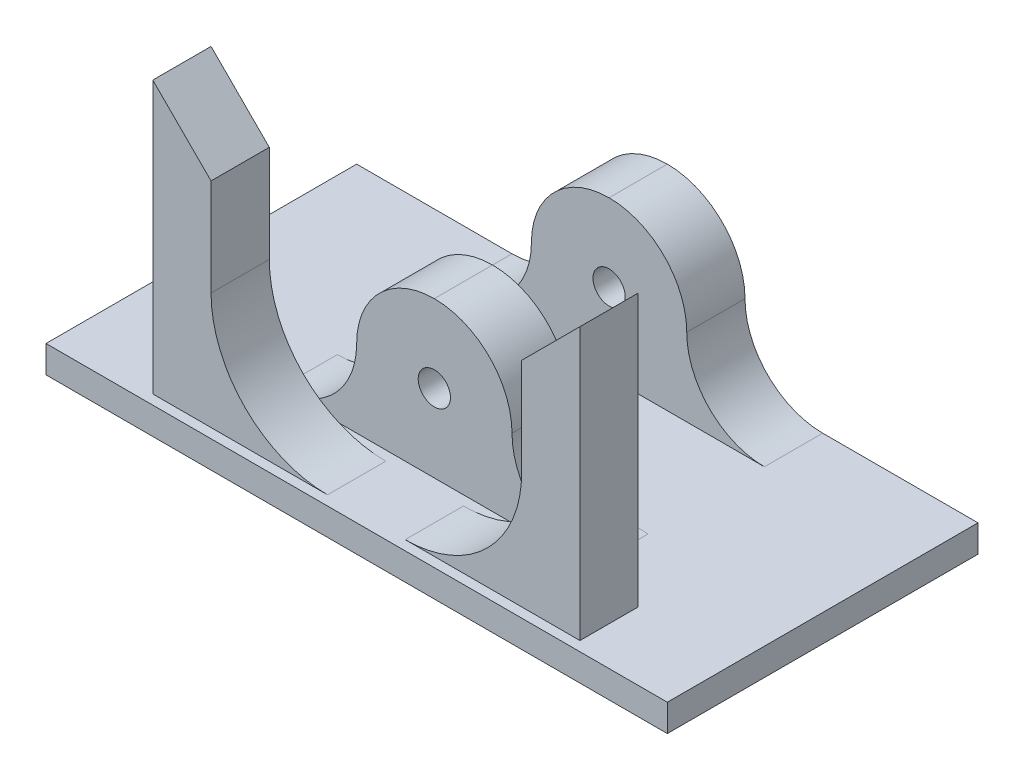
ISO-10303-21;
HEADER;
FILE_DESCRIPTION(('STEP AP214'),'2;1');
FILE_NAME('part.step','',(''),(''),'','','');
FILE_SCHEMA(('AUTOMOTIVE_DESIGN { 1 0 10303 214 1 1 1 1 }'));
ENDSEC;
DATA;
#1=APPLICATION_CONTEXT('core data for automotive mechanical design processes');
#2=APPLICATION_PROTOCOL_DEFINITION('international standard','automotive_design',2000,#1);
#3=PRODUCT_CONTEXT('',#1,'mechanical');
#4=PRODUCT('Part','Part','',(#3));
#5=PRODUCT_RELATED_PRODUCT_CATEGORY('part','',(#4));
#6=PRODUCT_DEFINITION_FORMATION('','',#4);
#7=PRODUCT_DEFINITION_CONTEXT('part definition',#1,'design');
#8=PRODUCT_DEFINITION('design','',#6,#7);
#9=PRODUCT_DEFINITION_SHAPE('','',#8);
#10=(LENGTH_UNIT() NAMED_UNIT(*) SI_UNIT(.MILLI.,.METRE.));
#11=(NAMED_UNIT(*) PLANE_ANGLE_UNIT() SI_UNIT($,.RADIAN.));
#12=(NAMED_UNIT(*) SI_UNIT($,.STERADIAN.) SOLID_ANGLE_UNIT());
#13=UNCERTAINTY_MEASURE_WITH_UNIT(LENGTH_MEASURE(1.E-05),#10,'distance_accuracy_value','');
#14=(GEOMETRIC_REPRESENTATION_CONTEXT(3) GLOBAL_UNCERTAINTY_ASSIGNED_CONTEXT((#13)) GLOBAL_UNIT_ASSIGNED_CONTEXT((#10,
#11,#12)) REPRESENTATION_CONTEXT('',''));
#15=CARTESIAN_POINT('',(0.,0.,0.));
#16=DIRECTION('',(0.,0.,1.));
#17=DIRECTION('',(1.,0.,0.));
#18=AXIS2_PLACEMENT_3D('',#15,#16,#17);
#19=CARTESIAN_POINT('',(0.,7.,0.));
#20=DIRECTION('',(0.,1.,0.));
#21=DIRECTION('',(0.,0.,1.));
#22=AXIS2_PLACEMENT_3D('',#19,#20,#21);
#23=PLANE('',#22);
#24=DIRECTION('',(-1.,0.,0.));
#25=VECTOR('',#24,1.);
#26=CARTESIAN_POINT('',(-160.,7.,20.));
#27=LINE('',#26,#25);
#28=CARTESIAN_POINT('',(0.,7.,20.));
#29=VERTEX_POINT('',#28);
#30=CARTESIAN_POINT('',(-160.,7.,20.));
#31=VERTEX_POINT('',#30);
#32=EDGE_CURVE('E260',#29,#31,#27,.T.);
#33=ORIENTED_EDGE('',*,*,#32,.F.);
#34=DIRECTION('',(0.,0.,-1.));
#35=VECTOR('',#34,1.);
#36=CARTESIAN_POINT('',(0.,7.,0.));
#37=LINE('',#36,#35);
#38=CARTESIAN_POINT('',(0.,7.,-60.));
#39=VERTEX_POINT('',#38);
#40=EDGE_CURVE('E287',#29,#39,#37,.T.);
#41=ORIENTED_EDGE('',*,*,#40,.T.);
#42=DIRECTION('',(-1.,0.,0.));
#43=VECTOR('',#42,1.);
#44=CARTESIAN_POINT('',(0.,7.,-60.));
#45=LINE('',#44,#43);
#46=CARTESIAN_POINT('',(-40.,7.,-60.));
#47=VERTEX_POINT('',#46);
#48=EDGE_CURVE('E292',#39,#47,#45,.T.);
#49=ORIENTED_EDGE('',*,*,#48,.T.);
#50=DIRECTION('',(0.,0.,-1.));
#51=VECTOR('',#50,1.);
#52=CARTESIAN_POINT('',(-40.,7.,0.));
#53=LINE('',#52,#51);
#54=CARTESIAN_POINT('',(-40.,7.,-45.));
#55=VERTEX_POINT('',#54);
#56=EDGE_CURVE('E336',#47,#55,#53,.F.);
#57=ORIENTED_EDGE('',*,*,#56,.T.);
#58=DIRECTION('',(1.,0.,0.));
#59=VECTOR('',#58,1.);
#60=CARTESIAN_POINT('',(-100.,7.,-45.));
#61=LINE('',#60,#59);
#62=CARTESIAN_POINT('',(-120.,7.,-45.));
#63=VERTEX_POINT('',#62);
#64=EDGE_CURVE('E278',#63,#55,#61,.T.);
#65=ORIENTED_EDGE('',*,*,#64,.F.);
#66=DIRECTION('',(0.,0.,1.));
#67=VECTOR('',#66,1.);
#68=CARTESIAN_POINT('',(-120.,7.,0.));
#69=LINE('',#68,#67);
#70=CARTESIAN_POINT('',(-120.,7.,-60.));
#71=VERTEX_POINT('',#70);
#72=EDGE_CURVE('E344',#63,#71,#69,.F.);
#73=ORIENTED_EDGE('',*,*,#72,.T.);
#74=CARTESIAN_POINT('',(-160.,7.,-60.));
#75=VERTEX_POINT('',#74);
#76=EDGE_CURVE('E290',#71,#75,#45,.T.);
#77=ORIENTED_EDGE('',*,*,#76,.T.);
#78=DIRECTION('',(0.,0.,1.));
#79=VECTOR('',#78,1.);
#80=CARTESIAN_POINT('',(-160.,7.,0.));
#81=LINE('',#80,#79);
#82=EDGE_CURVE('E295',#75,#31,#81,.T.);
#83=ORIENTED_EDGE('',*,*,#82,.T.);
#84=EDGE_LOOP('',(#33,#41,#49,#57,#65,#73,#77,#83));
#85=FACE_BOUND('',#84,.T.);
#86=DIRECTION('',(0.,0.,-1.));
#87=VECTOR('',#86,1.);
#88=CARTESIAN_POINT('',(-40.,7.,0.));
#89=LINE('',#88,#87);
#90=CARTESIAN_POINT('',(-40.,7.,-15.));
#91=VERTEX_POINT('',#90);
#92=CARTESIAN_POINT('',(-40.,7.,0.));
#93=VERTEX_POINT('',#92);
#94=EDGE_CURVE('E341',#91,#93,#89,.F.);
#95=ORIENTED_EDGE('',*,*,#94,.T.);
#96=DIRECTION('',(-1.,0.,0.));
#97=VECTOR('',#96,1.);
#98=CARTESIAN_POINT('',(-160.,7.,0.));
#99=LINE('',#98,#97);
#100=CARTESIAN_POINT('',(-120.,7.,0.));
#101=VERTEX_POINT('',#100);
#102=EDGE_CURVE('E264',#93,#101,#99,.T.);
#103=ORIENTED_EDGE('',*,*,#102,.T.);
#104=DIRECTION('',(0.,0.,1.));
#105=VECTOR('',#104,1.);
#106=CARTESIAN_POINT('',(-120.,7.,0.));
#107=LINE('',#106,#105);
#108=CARTESIAN_POINT('',(-120.,7.,-15.));
#109=VERTEX_POINT('',#108);
#110=EDGE_CURVE('E346',#101,#109,#107,.F.);
#111=ORIENTED_EDGE('',*,*,#110,.T.);
#112=DIRECTION('',(1.,0.,0.));
#113=VECTOR('',#112,1.);
#114=CARTESIAN_POINT('',(-100.,7.,-15.));
#115=LINE('',#114,#113);
#116=EDGE_CURVE('E277',#109,#91,#115,.T.);
#117=ORIENTED_EDGE('',*,*,#116,.T.);
#118=EDGE_LOOP('',(#95,#103,#111,#117));
#119=FACE_BOUND('',#118,.T.);
#120=DIRECTION('',(-1.,0.,0.));
#121=VECTOR('',#120,1.);
#122=CARTESIAN_POINT('',(-135.,7.,2.5));
#123=LINE('',#122,#121);
#124=CARTESIAN_POINT('',(-90.,7.,2.5));
#125=VERTEX_POINT('',#124);
#126=CARTESIAN_POINT('',(-135.,7.,2.5));
#127=VERTEX_POINT('',#126);
#128=EDGE_CURVE('E237',#125,#127,#123,.T.);
#129=ORIENTED_EDGE('',*,*,#128,.F.);
#130=DIRECTION('',(0.,0.,-1.));
#131=VECTOR('',#130,1.);
#132=CARTESIAN_POINT('',(-90.,7.,0.));
#133=LINE('',#132,#131);
#134=CARTESIAN_POINT('',(-90.,7.,17.5));
#135=VERTEX_POINT('',#134);
#136=EDGE_CURVE('E369',#125,#135,#133,.F.);
#137=ORIENTED_EDGE('',*,*,#136,.T.);
#138=DIRECTION('',(1.,0.,0.));
#139=VECTOR('',#138,1.);
#140=CARTESIAN_POINT('',(-135.,7.,17.5));
#141=LINE('',#140,#139);
#142=CARTESIAN_POINT('',(-135.,7.,17.5));
#143=VERTEX_POINT('',#142);
#144=EDGE_CURVE('E240',#143,#135,#141,.T.);
#145=ORIENTED_EDGE('',*,*,#144,.F.);
#146=DIRECTION('',(0.,0.,1.));
#147=VECTOR('',#146,1.);
#148=CARTESIAN_POINT('',(-135.,7.,2.5));
#149=LINE('',#148,#147);
#150=EDGE_CURVE('E216',#127,#143,#149,.T.);
#151=ORIENTED_EDGE('',*,*,#150,.F.);
#152=EDGE_LOOP('',(#129,#137,#145,#151));
#153=FACE_BOUND('',#152,.T.);
#154=DIRECTION('',(1.,0.,0.));
#155=VECTOR('',#154,1.);
#156=CARTESIAN_POINT('',(-25.,7.,17.5));
#157=LINE('',#156,#155);
#158=CARTESIAN_POINT('',(-70.,7.,17.5));
#159=VERTEX_POINT('',#158);
#160=CARTESIAN_POINT('',(-25.,7.,17.5));
#161=VERTEX_POINT('',#160);
#162=EDGE_CURVE('E222',#159,#161,#157,.T.);
#163=ORIENTED_EDGE('',*,*,#162,.F.);
#164=DIRECTION('',(0.,0.,1.));
#165=VECTOR('',#164,1.);
#166=CARTESIAN_POINT('',(-70.,7.,0.));
#167=LINE('',#166,#165);
#168=CARTESIAN_POINT('',(-70.,7.,2.5));
#169=VERTEX_POINT('',#168);
#170=EDGE_CURVE('E372',#159,#169,#167,.F.);
#171=ORIENTED_EDGE('',*,*,#170,.T.);
#172=DIRECTION('',(-1.,0.,0.));
#173=VECTOR('',#172,1.);
#174=CARTESIAN_POINT('',(-25.,7.,2.5));
#175=LINE('',#174,#173);
#176=CARTESIAN_POINT('',(-25.,7.,2.5));
#177=VERTEX_POINT('',#176);
#178=EDGE_CURVE('E226',#177,#169,#175,.T.);
#179=ORIENTED_EDGE('',*,*,#178,.F.);
#180=DIRECTION('',(0.,0.,-1.));
#181=VECTOR('',#180,1.);
#182=CARTESIAN_POINT('',(-25.,7.,2.5));
#183=LINE('',#182,#181);
#184=EDGE_CURVE('E214',#161,#177,#183,.T.);
#185=ORIENTED_EDGE('',*,*,#184,.F.);
#186=EDGE_LOOP('',(#163,#171,#179,#185));
#187=FACE_BOUND('',#186,.T.);
#188=ADVANCED_FACE('F36',(#85,#119,#153,#187),#23,.T.);
#189=CARTESIAN_POINT('',(0.,7.,0.));
#190=DIRECTION('',(0.,0.,-1.));
#191=DIRECTION('',(-1.,0.,0.));
#192=AXIS2_PLACEMENT_3D('',#189,#190,#191);
#193=PLANE('',#192);
#194=CARTESIAN_POINT('',(-80.,27.,0.));
#195=DIRECTION('',(0.,0.,1.));
#196=DIRECTION('',(1.,0.,0.));
#197=AXIS2_PLACEMENT_3D('',#194,#195,#196);
#198=CIRCLE('',#197,4.15);
#199=CARTESIAN_POINT('',(-75.85,27.,0.));
#200=VERTEX_POINT('',#199);
#201=EDGE_CURVE('E263',#200,#200,#198,.T.);
#202=ORIENTED_EDGE('',*,*,#201,.F.);
#203=EDGE_LOOP('',(#202));
#204=FACE_BOUND('',#203,.T.);
#205=ORIENTED_EDGE('',*,*,#102,.F.);
#206=CARTESIAN_POINT('',(-40.,27.,0.));
#207=DIRECTION('',(0.,0.,-1.));
#208=DIRECTION('',(-1.,0.,0.));
#209=AXIS2_PLACEMENT_3D('',#206,#207,#208);
#210=CIRCLE('',#209,20.);
#211=CARTESIAN_POINT('',(-60.,27.,0.));
#212=VERTEX_POINT('',#211);
#213=EDGE_CURVE('E362',#93,#212,#210,.T.);
#214=ORIENTED_EDGE('',*,*,#213,.T.);
#215=CARTESIAN_POINT('',(-80.,27.,0.));
#216=DIRECTION('',(0.,0.,-1.));
#217=DIRECTION('',(-1.,0.,0.));
#218=AXIS2_PLACEMENT_3D('',#215,#216,#217);
#219=CIRCLE('',#218,20.);
#220=CARTESIAN_POINT('',(-80.,47.,0.));
#221=VERTEX_POINT('',#220);
#222=EDGE_CURVE('E322',#212,#221,#219,.F.);
#223=ORIENTED_EDGE('',*,*,#222,.T.);
#224=CARTESIAN_POINT('',(-80.,27.,0.));
#225=DIRECTION('',(0.,0.,-1.));
#226=DIRECTION('',(-1.,0.,0.));
#227=AXIS2_PLACEMENT_3D('',#224,#225,#226);
#228=CIRCLE('',#227,20.);
#229=CARTESIAN_POINT('',(-100.,27.,0.));
#230=VERTEX_POINT('',#229);
#231=EDGE_CURVE('E319',#221,#230,#228,.F.);
#232=ORIENTED_EDGE('',*,*,#231,.T.);
#233=CARTESIAN_POINT('',(-120.,27.,0.));
#234=DIRECTION('',(0.,0.,-1.));
#235=DIRECTION('',(-1.,0.,0.));
#236=AXIS2_PLACEMENT_3D('',#233,#234,#235);
#237=CIRCLE('',#236,20.);
#238=EDGE_CURVE('E349',#230,#101,#237,.T.);
#239=ORIENTED_EDGE('',*,*,#238,.T.);
#240=EDGE_LOOP('',(#205,#214,#223,#232,#239));
#241=FACE_BOUND('',#240,.T.);
#242=ADVANCED_FACE('F404',(#204,#241),#193,.F.);
#243=CARTESIAN_POINT('',(-80.,27.,0.));
#244=DIRECTION('',(0.,0.,-1.));
#245=DIRECTION('',(-1.,0.,0.));
#246=AXIS2_PLACEMENT_3D('',#243,#244,#245);
#247=CYLINDRICAL_SURFACE('',#246,20.);
#248=CARTESIAN_POINT('',(-80.,27.,-15.));
#249=DIRECTION('',(0.,0.,1.));
#250=DIRECTION('',(1.,0.,0.));
#251=AXIS2_PLACEMENT_3D('',#248,#249,#250);
#252=CIRCLE('',#251,20.);
#253=CARTESIAN_POINT('',(-100.,27.,-15.));
#254=VERTEX_POINT('',#253);
#255=CARTESIAN_POINT('',(-80.,47.,-15.));
#256=VERTEX_POINT('',#255);
#257=EDGE_CURVE('E284',#254,#256,#252,.F.);
#258=ORIENTED_EDGE('',*,*,#257,.F.);
#259=DIRECTION('',(0.,0.,1.));
#260=VECTOR('',#259,1.);
#261=CARTESIAN_POINT('',(-100.,27.,-60.));
#262=LINE('',#261,#260);
#263=EDGE_CURVE('E326',#230,#254,#262,.F.);
#264=ORIENTED_EDGE('',*,*,#263,.F.);
#265=ORIENTED_EDGE('',*,*,#231,.F.);
#266=DIRECTION('',(0.,0.,1.));
#267=VECTOR('',#266,1.);
#268=CARTESIAN_POINT('',(-80.,47.,0.));
#269=LINE('',#268,#267);
#270=EDGE_CURVE('E286',#256,#221,#269,.T.);
#271=ORIENTED_EDGE('',*,*,#270,.F.);
#272=EDGE_LOOP('',(#258,#264,#265,#271));
#273=FACE_BOUND('',#272,.T.);
#274=ADVANCED_FACE('F410',(#273),#247,.T.);
#275=CARTESIAN_POINT('',(-80.,27.,0.));
#276=DIRECTION('',(0.,0.,1.));
#277=DIRECTION('',(1.,0.,0.));
#278=AXIS2_PLACEMENT_3D('',#275,#276,#277);
#279=CYLINDRICAL_SURFACE('',#278,20.);
#280=CARTESIAN_POINT('',(-80.,27.,-15.));
#281=DIRECTION('',(0.,0.,1.));
#282=DIRECTION('',(1.,0.,0.));
#283=AXIS2_PLACEMENT_3D('',#280,#281,#282);
#284=CIRCLE('',#283,20.);
#285=CARTESIAN_POINT('',(-60.,27.,-15.));
#286=VERTEX_POINT('',#285);
#287=EDGE_CURVE('E333',#256,#286,#284,.F.);
#288=ORIENTED_EDGE('',*,*,#287,.F.);
#289=ORIENTED_EDGE('',*,*,#270,.T.);
#290=ORIENTED_EDGE('',*,*,#222,.F.);
#291=DIRECTION('',(0.,0.,-1.));
#292=VECTOR('',#291,1.);
#293=CARTESIAN_POINT('',(-60.,27.,0.));
#294=LINE('',#293,#292);
#295=EDGE_CURVE('E315',#286,#212,#294,.F.);
#296=ORIENTED_EDGE('',*,*,#295,.F.);
#297=EDGE_LOOP('',(#288,#289,#290,#296));
#298=FACE_BOUND('',#297,.T.);
#299=ADVANCED_FACE('F435',(#298),#279,.T.);
#300=CARTESIAN_POINT('',(0.,7.,0.));
#301=DIRECTION('',(-1.,0.,0.));
#302=DIRECTION('',(0.,0.,1.));
#303=AXIS2_PLACEMENT_3D('',#300,#301,#302);
#304=PLANE('',#303);
#305=DIRECTION('',(0.,0.,-1.));
#306=VECTOR('',#305,1.);
#307=CARTESIAN_POINT('',(0.,0.,0.));
#308=LINE('',#307,#306);
#309=CARTESIAN_POINT('',(0.,0.,20.));
#310=VERTEX_POINT('',#309);
#311=CARTESIAN_POINT('',(0.,0.,-60.));
#312=VERTEX_POINT('',#311);
#313=EDGE_CURVE('E298',#310,#312,#308,.T.);
#314=ORIENTED_EDGE('',*,*,#313,.T.);
#315=DIRECTION('',(0.,-1.,0.));
#316=VECTOR('',#315,1.);
#317=CARTESIAN_POINT('',(0.,7.,-60.));
#318=LINE('',#317,#316);
#319=EDGE_CURVE('E307',#39,#312,#318,.T.);
#320=ORIENTED_EDGE('',*,*,#319,.F.);
#321=ORIENTED_EDGE('',*,*,#40,.F.);
#322=DIRECTION('',(0.,1.,0.));
#323=VECTOR('',#322,1.);
#324=CARTESIAN_POINT('',(0.,7.,20.));
#325=LINE('',#324,#323);
#326=EDGE_CURVE('E257',#310,#29,#325,.T.);
#327=ORIENTED_EDGE('',*,*,#326,.F.);
#328=EDGE_LOOP('',(#314,#320,#321,#327));
#329=FACE_BOUND('',#328,.T.);
#330=ADVANCED_FACE('F431',(#329),#304,.F.);
#331=CARTESIAN_POINT('',(0.,7.,-60.));
#332=DIRECTION('',(0.,0.,1.));
#333=DIRECTION('',(1.,0.,0.));
#334=AXIS2_PLACEMENT_3D('',#331,#332,#333);
#335=PLANE('',#334);
#336=CARTESIAN_POINT('',(-80.,27.,-60.));
#337=DIRECTION('',(0.,0.,1.));
#338=DIRECTION('',(1.,0.,0.));
#339=AXIS2_PLACEMENT_3D('',#336,#337,#338);
#340=CIRCLE('',#339,4.15);
#341=CARTESIAN_POINT('',(-75.85,27.,-60.));
#342=VERTEX_POINT('',#341);
#343=EDGE_CURVE('E268',#342,#342,#340,.T.);
#344=ORIENTED_EDGE('',*,*,#343,.T.);
#345=EDGE_LOOP('',(#344));
#346=FACE_BOUND('',#345,.T.);
#347=CARTESIAN_POINT('',(-80.,27.,-60.));
#348=DIRECTION('',(0.,0.,1.));
#349=DIRECTION('',(1.,0.,0.));
#350=AXIS2_PLACEMENT_3D('',#347,#348,#349);
#351=CIRCLE('',#350,20.);
#352=CARTESIAN_POINT('',(-100.,27.,-60.));
#353=VERTEX_POINT('',#352);
#354=CARTESIAN_POINT('',(-80.,47.,-60.));
#355=VERTEX_POINT('',#354);
#356=EDGE_CURVE('E310',#353,#355,#351,.F.);
#357=ORIENTED_EDGE('',*,*,#356,.T.);
#358=CARTESIAN_POINT('',(-80.,27.,-60.));
#359=DIRECTION('',(0.,0.,1.));
#360=DIRECTION('',(1.,0.,0.));
#361=AXIS2_PLACEMENT_3D('',#358,#359,#360);
#362=CIRCLE('',#361,20.);
#363=CARTESIAN_POINT('',(-60.,27.,-60.));
#364=VERTEX_POINT('',#363);
#365=EDGE_CURVE('E312',#355,#364,#362,.F.);
#366=ORIENTED_EDGE('',*,*,#365,.T.);
#367=CARTESIAN_POINT('',(-40.,27.,-60.));
#368=DIRECTION('',(0.,0.,1.));
#369=DIRECTION('',(1.,0.,0.));
#370=AXIS2_PLACEMENT_3D('',#367,#368,#369);
#371=CIRCLE('',#370,20.);
#372=EDGE_CURVE('E364',#364,#47,#371,.T.);
#373=ORIENTED_EDGE('',*,*,#372,.T.);
#374=ORIENTED_EDGE('',*,*,#48,.F.);
#375=ORIENTED_EDGE('',*,*,#319,.T.);
#376=DIRECTION('',(-1.,0.,0.));
#377=VECTOR('',#376,1.);
#378=CARTESIAN_POINT('',(0.,0.,-60.));
#379=LINE('',#378,#377);
#380=CARTESIAN_POINT('',(-160.,0.,-60.));
#381=VERTEX_POINT('',#380);
#382=EDGE_CURVE('E301',#312,#381,#379,.T.);
#383=ORIENTED_EDGE('',*,*,#382,.T.);
#384=DIRECTION('',(0.,-1.,0.));
#385=VECTOR('',#384,1.);
#386=CARTESIAN_POINT('',(-160.,7.,-60.));
#387=LINE('',#386,#385);
#388=EDGE_CURVE('E297',#75,#381,#387,.T.);
#389=ORIENTED_EDGE('',*,*,#388,.F.);
#390=ORIENTED_EDGE('',*,*,#76,.F.);
#391=CARTESIAN_POINT('',(-120.,27.,-60.));
#392=DIRECTION('',(0.,0.,1.));
#393=DIRECTION('',(1.,0.,0.));
#394=AXIS2_PLACEMENT_3D('',#391,#392,#393);
#395=CIRCLE('',#394,20.);
#396=EDGE_CURVE('E357',#71,#353,#395,.T.);
#397=ORIENTED_EDGE('',*,*,#396,.T.);
#398=EDGE_LOOP('',(#357,#366,#373,#374,#375,#383,#389,#390,#397));
#399=FACE_BOUND('',#398,.T.);
#400=ADVANCED_FACE('F427',(#346,#399),#335,.F.);
#401=CARTESIAN_POINT('',(-160.,7.,0.));
#402=DIRECTION('',(1.,0.,0.));
#403=DIRECTION('',(0.,0.,-1.));
#404=AXIS2_PLACEMENT_3D('',#401,#402,#403);
#405=PLANE('',#404);
#406=DIRECTION('',(0.,0.,1.));
#407=VECTOR('',#406,1.);
#408=CARTESIAN_POINT('',(-160.,0.,0.));
#409=LINE('',#408,#407);
#410=CARTESIAN_POINT('',(-160.,0.,20.));
#411=VERTEX_POINT('',#410);
#412=EDGE_CURVE('E291',#381,#411,#409,.T.);
#413=ORIENTED_EDGE('',*,*,#412,.T.);
#414=DIRECTION('',(0.,-1.,0.));
#415=VECTOR('',#414,1.);
#416=CARTESIAN_POINT('',(-160.,7.,20.));
#417=LINE('',#416,#415);
#418=EDGE_CURVE('E251',#31,#411,#417,.T.);
#419=ORIENTED_EDGE('',*,*,#418,.F.);
#420=ORIENTED_EDGE('',*,*,#82,.F.);
#421=ORIENTED_EDGE('',*,*,#388,.T.);
#422=EDGE_LOOP('',(#413,#419,#420,#421));
#423=FACE_BOUND('',#422,.T.);
#424=ADVANCED_FACE('F422',(#423),#405,.F.);
#425=CARTESIAN_POINT('',(0.,0.,0.));
#426=DIRECTION('',(0.,1.,0.));
#427=DIRECTION('',(0.,0.,1.));
#428=AXIS2_PLACEMENT_3D('',#425,#426,#427);
#429=PLANE('',#428);
#430=ORIENTED_EDGE('',*,*,#313,.F.);
#431=DIRECTION('',(1.,0.,0.));
#432=VECTOR('',#431,1.);
#433=CARTESIAN_POINT('',(-160.,0.,20.));
#434=LINE('',#433,#432);
#435=EDGE_CURVE('E254',#411,#310,#434,.T.);
#436=ORIENTED_EDGE('',*,*,#435,.F.);
#437=ORIENTED_EDGE('',*,*,#412,.F.);
#438=ORIENTED_EDGE('',*,*,#382,.F.);
#439=EDGE_LOOP('',(#430,#436,#437,#438));
#440=FACE_BOUND('',#439,.T.);
#441=ADVANCED_FACE('F419',(#440),#429,.F.);
#442=CARTESIAN_POINT('',(-80.,27.,-45.));
#443=DIRECTION('',(0.,0.,-1.));
#444=DIRECTION('',(-1.,0.,0.));
#445=AXIS2_PLACEMENT_3D('',#442,#443,#444);
#446=CIRCLE('',#445,20.);
#447=CARTESIAN_POINT('',(-80.,47.,-45.));
#448=VERTEX_POINT('',#447);
#449=CARTESIAN_POINT('',(-100.,27.,-45.));
#450=VERTEX_POINT('',#449);
#451=EDGE_CURVE('E280',#448,#450,#446,.F.);
#452=ORIENTED_EDGE('',*,*,#451,.F.);
#453=EDGE_CURVE('E302',#355,#448,#269,.T.);
#454=ORIENTED_EDGE('',*,*,#453,.F.);
#455=ORIENTED_EDGE('',*,*,#356,.F.);
#456=EDGE_CURVE('E325',#450,#353,#262,.F.);
#457=ORIENTED_EDGE('',*,*,#456,.F.);
#458=EDGE_LOOP('',(#452,#454,#455,#457));
#459=FACE_BOUND('',#458,.T.);
#460=ADVANCED_FACE('F421',(#459),#247,.T.);
#461=CARTESIAN_POINT('',(-80.,27.,-45.));
#462=DIRECTION('',(0.,0.,-1.));
#463=DIRECTION('',(-1.,0.,0.));
#464=AXIS2_PLACEMENT_3D('',#461,#462,#463);
#465=CIRCLE('',#464,20.);
#466=CARTESIAN_POINT('',(-60.,27.,-45.));
#467=VERTEX_POINT('',#466);
#468=EDGE_CURVE('E329',#467,#448,#465,.F.);
#469=ORIENTED_EDGE('',*,*,#468,.F.);
#470=EDGE_CURVE('E316',#364,#467,#294,.F.);
#471=ORIENTED_EDGE('',*,*,#470,.F.);
#472=ORIENTED_EDGE('',*,*,#365,.F.);
#473=ORIENTED_EDGE('',*,*,#453,.T.);
#474=EDGE_LOOP('',(#469,#471,#472,#473));
#475=FACE_BOUND('',#474,.T.);
#476=ADVANCED_FACE('F437',(#475),#279,.T.);
#477=CARTESIAN_POINT('',(-100.,7.,-15.));
#478=DIRECTION('',(0.,0.,1.));
#479=DIRECTION('',(1.,0.,0.));
#480=AXIS2_PLACEMENT_3D('',#477,#478,#479);
#481=PLANE('',#480);
#482=CARTESIAN_POINT('',(-80.,27.,-15.));
#483=DIRECTION('',(0.,0.,1.));
#484=DIRECTION('',(1.,0.,0.));
#485=AXIS2_PLACEMENT_3D('',#482,#483,#484);
#486=CIRCLE('',#485,4.15);
#487=CARTESIAN_POINT('',(-75.85,27.,-15.));
#488=VERTEX_POINT('',#487);
#489=EDGE_CURVE('E274',#488,#488,#486,.T.);
#490=ORIENTED_EDGE('',*,*,#489,.T.);
#491=EDGE_LOOP('',(#490));
#492=FACE_BOUND('',#491,.T.);
#493=ORIENTED_EDGE('',*,*,#257,.T.);
#494=ORIENTED_EDGE('',*,*,#287,.T.);
#495=CARTESIAN_POINT('',(-40.,27.,-15.));
#496=DIRECTION('',(0.,0.,1.));
#497=DIRECTION('',(1.,0.,0.));
#498=AXIS2_PLACEMENT_3D('',#495,#496,#497);
#499=CIRCLE('',#498,20.);
#500=EDGE_CURVE('E359',#286,#91,#499,.T.);
#501=ORIENTED_EDGE('',*,*,#500,.T.);
#502=ORIENTED_EDGE('',*,*,#116,.F.);
#503=CARTESIAN_POINT('',(-120.,27.,-15.));
#504=DIRECTION('',(0.,0.,1.));
#505=DIRECTION('',(1.,0.,0.));
#506=AXIS2_PLACEMENT_3D('',#503,#504,#505);
#507=CIRCLE('',#506,20.);
#508=EDGE_CURVE('E352',#109,#254,#507,.T.);
#509=ORIENTED_EDGE('',*,*,#508,.T.);
#510=EDGE_LOOP('',(#493,#494,#501,#502,#509));
#511=FACE_BOUND('',#510,.T.);
#512=ADVANCED_FACE('F417',(#492,#511),#481,.F.);
#513=CARTESIAN_POINT('',(-100.,7.,-45.));
#514=DIRECTION('',(0.,0.,-1.));
#515=DIRECTION('',(-1.,0.,0.));
#516=AXIS2_PLACEMENT_3D('',#513,#514,#515);
#517=PLANE('',#516);
#518=CARTESIAN_POINT('',(-80.,27.,-45.));
#519=DIRECTION('',(0.,0.,-1.));
#520=DIRECTION('',(-1.,0.,0.));
#521=AXIS2_PLACEMENT_3D('',#518,#519,#520);
#522=CIRCLE('',#521,4.15);
#523=CARTESIAN_POINT('',(-84.15,27.,-45.));
#524=VERTEX_POINT('',#523);
#525=EDGE_CURVE('E271',#524,#524,#522,.T.);
#526=ORIENTED_EDGE('',*,*,#525,.T.);
#527=EDGE_LOOP('',(#526));
#528=FACE_BOUND('',#527,.T.);
#529=ORIENTED_EDGE('',*,*,#451,.T.);
#530=CARTESIAN_POINT('',(-120.,27.,-45.));
#531=DIRECTION('',(0.,0.,-1.));
#532=DIRECTION('',(-1.,0.,0.));
#533=AXIS2_PLACEMENT_3D('',#530,#531,#532);
#534=CIRCLE('',#533,20.);
#535=EDGE_CURVE('E354',#450,#63,#534,.T.);
#536=ORIENTED_EDGE('',*,*,#535,.T.);
#537=ORIENTED_EDGE('',*,*,#64,.T.);
#538=CARTESIAN_POINT('',(-40.,27.,-45.));
#539=DIRECTION('',(0.,0.,-1.));
#540=DIRECTION('',(-1.,0.,0.));
#541=AXIS2_PLACEMENT_3D('',#538,#539,#540);
#542=CIRCLE('',#541,20.);
#543=EDGE_CURVE('E267',#55,#467,#542,.T.);
#544=ORIENTED_EDGE('',*,*,#543,.T.);
#545=ORIENTED_EDGE('',*,*,#468,.T.);
#546=EDGE_LOOP('',(#529,#536,#537,#544,#545));
#547=FACE_BOUND('',#546,.T.);
#548=ADVANCED_FACE('F513',(#528,#547),#517,.F.);
#549=CARTESIAN_POINT('',(-80.,27.,-60.));
#550=DIRECTION('',(0.,0.,1.));
#551=DIRECTION('',(1.,0.,0.));
#552=AXIS2_PLACEMENT_3D('',#549,#550,#551);
#553=CYLINDRICAL_SURFACE('',#552,4.15);
#554=ORIENTED_EDGE('',*,*,#343,.F.);
#555=EDGE_LOOP('',(#554));
#556=FACE_BOUND('',#555,.T.);
#557=ORIENTED_EDGE('',*,*,#525,.F.);
#558=EDGE_LOOP('',(#557));
#559=FACE_BOUND('',#558,.T.);
#560=ADVANCED_FACE('F511',(#556,#559),#553,.F.);
#561=ORIENTED_EDGE('',*,*,#201,.T.);
#562=EDGE_LOOP('',(#561));
#563=FACE_BOUND('',#562,.T.);
#564=ORIENTED_EDGE('',*,*,#489,.F.);
#565=EDGE_LOOP('',(#564));
#566=FACE_BOUND('',#565,.T.);
#567=ADVANCED_FACE('F448',(#563,#566),#553,.F.);
#568=CARTESIAN_POINT('',(-120.,27.,-60.));
#569=DIRECTION('',(0.,0.,1.));
#570=DIRECTION('',(1.,0.,0.));
#571=AXIS2_PLACEMENT_3D('',#568,#569,#570);
#572=CYLINDRICAL_SURFACE('',#571,20.);
#573=ORIENTED_EDGE('',*,*,#508,.F.);
#574=ORIENTED_EDGE('',*,*,#110,.F.);
#575=ORIENTED_EDGE('',*,*,#238,.F.);
#576=ORIENTED_EDGE('',*,*,#263,.T.);
#577=EDGE_LOOP('',(#573,#574,#575,#576));
#578=FACE_BOUND('',#577,.T.);
#579=ADVANCED_FACE('F444',(#578),#572,.F.);
#580=CARTESIAN_POINT('',(-120.,27.,-60.));
#581=DIRECTION('',(0.,0.,1.));
#582=DIRECTION('',(1.,0.,0.));
#583=AXIS2_PLACEMENT_3D('',#580,#581,#582);
#584=CYLINDRICAL_SURFACE('',#583,20.);
#585=ORIENTED_EDGE('',*,*,#396,.F.);
#586=ORIENTED_EDGE('',*,*,#72,.F.);
#587=ORIENTED_EDGE('',*,*,#535,.F.);
#588=ORIENTED_EDGE('',*,*,#456,.T.);
#589=EDGE_LOOP('',(#585,#586,#587,#588));
#590=FACE_BOUND('',#589,.T.);
#591=ADVANCED_FACE('F447',(#590),#584,.F.);
#592=CARTESIAN_POINT('',(-40.,27.,-60.));
#593=DIRECTION('',(0.,0.,-1.));
#594=DIRECTION('',(-1.,0.,0.));
#595=AXIS2_PLACEMENT_3D('',#592,#593,#594);
#596=CYLINDRICAL_SURFACE('',#595,20.);
#597=ORIENTED_EDGE('',*,*,#213,.F.);
#598=ORIENTED_EDGE('',*,*,#94,.F.);
#599=ORIENTED_EDGE('',*,*,#500,.F.);
#600=ORIENTED_EDGE('',*,*,#295,.T.);
#601=EDGE_LOOP('',(#597,#598,#599,#600));
#602=FACE_BOUND('',#601,.T.);
#603=ADVANCED_FACE('F452',(#602),#596,.F.);
#604=CARTESIAN_POINT('',(-40.,27.,-60.));
#605=DIRECTION('',(0.,0.,-1.));
#606=DIRECTION('',(-1.,0.,0.));
#607=AXIS2_PLACEMENT_3D('',#604,#605,#606);
#608=CYLINDRICAL_SURFACE('',#607,20.);
#609=ORIENTED_EDGE('',*,*,#543,.F.);
#610=ORIENTED_EDGE('',*,*,#56,.F.);
#611=ORIENTED_EDGE('',*,*,#372,.F.);
#612=ORIENTED_EDGE('',*,*,#470,.T.);
#613=EDGE_LOOP('',(#609,#610,#611,#612));
#614=FACE_BOUND('',#613,.T.);
#615=ADVANCED_FACE('F456',(#614),#608,.F.);
#616=CARTESIAN_POINT('',(0.,0.,20.));
#617=DIRECTION('',(0.,0.,1.));
#618=DIRECTION('',(1.,0.,0.));
#619=AXIS2_PLACEMENT_3D('',#616,#617,#618);
#620=PLANE('',#619);
#621=ORIENTED_EDGE('',*,*,#418,.T.);
#622=ORIENTED_EDGE('',*,*,#435,.T.);
#623=ORIENTED_EDGE('',*,*,#326,.T.);
#624=ORIENTED_EDGE('',*,*,#32,.T.);
#625=EDGE_LOOP('',(#621,#622,#623,#624));
#626=FACE_BOUND('',#625,.T.);
#627=ADVANCED_FACE('F460',(#626),#620,.T.);
#628=CARTESIAN_POINT('',(-135.,77.,2.5));
#629=DIRECTION('',(1.,0.,0.));
#630=DIRECTION('',(0.,0.,-1.));
#631=AXIS2_PLACEMENT_3D('',#628,#629,#630);
#632=PLANE('',#631);
#633=ORIENTED_EDGE('',*,*,#150,.T.);
#634=DIRECTION('',(0.,-1.,0.));
#635=VECTOR('',#634,1.);
#636=CARTESIAN_POINT('',(-135.,77.,17.5));
#637=LINE('',#636,#635);
#638=CARTESIAN_POINT('',(-135.,77.,17.5));
#639=VERTEX_POINT('',#638);
#640=EDGE_CURVE('E249',#639,#143,#637,.T.);
#641=ORIENTED_EDGE('',*,*,#640,.F.);
#642=DIRECTION('',(0.,0.,1.));
#643=VECTOR('',#642,1.);
#644=CARTESIAN_POINT('',(-135.,77.,2.5));
#645=LINE('',#644,#643);
#646=CARTESIAN_POINT('',(-135.,77.,2.5));
#647=VERTEX_POINT('',#646);
#648=EDGE_CURVE('E233',#647,#639,#645,.T.);
#649=ORIENTED_EDGE('',*,*,#648,.F.);
#650=DIRECTION('',(0.,-1.,0.));
#651=VECTOR('',#650,1.);
#652=CARTESIAN_POINT('',(-135.,77.,2.5));
#653=LINE('',#652,#651);
#654=EDGE_CURVE('E236',#647,#127,#653,.T.);
#655=ORIENTED_EDGE('',*,*,#654,.T.);
#656=EDGE_LOOP('',(#633,#641,#649,#655));
#657=FACE_BOUND('',#656,.T.);
#658=ADVANCED_FACE('F483',(#657),#632,.F.);
#659=CARTESIAN_POINT('',(-135.,77.,17.5));
#660=DIRECTION('',(0.,0.,-1.));
#661=DIRECTION('',(-1.,0.,0.));
#662=AXIS2_PLACEMENT_3D('',#659,#660,#661);
#663=PLANE('',#662);
#664=DIRECTION('',(0.,-1.,0.));
#665=VECTOR('',#664,1.);
#666=CARTESIAN_POINT('',(-120.,77.,17.5));
#667=LINE('',#666,#665);
#668=CARTESIAN_POINT('',(-120.,62.,17.5));
#669=VERTEX_POINT('',#668);
#670=CARTESIAN_POINT('',(-120.,37.,17.5));
#671=VERTEX_POINT('',#670);
#672=EDGE_CURVE('E247',#669,#671,#667,.T.);
#673=ORIENTED_EDGE('',*,*,#672,.F.);
#674=DIRECTION('',(-0.707106781186546,0.707106781186549,0.));
#675=VECTOR('',#674,1.);
#676=CARTESIAN_POINT('',(-135.,77.,17.5));
#677=LINE('',#676,#675);
#678=EDGE_CURVE('E11',#669,#639,#677,.T.);
#679=ORIENTED_EDGE('',*,*,#678,.T.);
#680=ORIENTED_EDGE('',*,*,#640,.T.);
#681=ORIENTED_EDGE('',*,*,#144,.T.);
#682=CARTESIAN_POINT('',(-90.,37.,17.5));
#683=DIRECTION('',(0.,0.,-1.));
#684=DIRECTION('',(-1.,0.,0.));
#685=AXIS2_PLACEMENT_3D('',#682,#683,#684);
#686=CIRCLE('',#685,30.);
#687=EDGE_CURVE('E386',#135,#671,#686,.T.);
#688=ORIENTED_EDGE('',*,*,#687,.T.);
#689=EDGE_LOOP('',(#673,#679,#680,#681,#688));
#690=FACE_BOUND('',#689,.T.);
#691=ADVANCED_FACE('F481',(#690),#663,.F.);
#692=CARTESIAN_POINT('',(-120.,77.,2.5));
#693=DIRECTION('',(-1.,0.,0.));
#694=DIRECTION('',(0.,0.,1.));
#695=AXIS2_PLACEMENT_3D('',#692,#693,#694);
#696=PLANE('',#695);
#697=DIRECTION('',(0.,-1.,0.));
#698=VECTOR('',#697,1.);
#699=CARTESIAN_POINT('',(-120.,77.,2.5));
#700=LINE('',#699,#698);
#701=CARTESIAN_POINT('',(-120.,62.,2.5));
#702=VERTEX_POINT('',#701);
#703=CARTESIAN_POINT('',(-120.,37.,2.5));
#704=VERTEX_POINT('',#703);
#705=EDGE_CURVE('E245',#702,#704,#700,.T.);
#706=ORIENTED_EDGE('',*,*,#705,.F.);
#707=DIRECTION('',(0.,0.,1.));
#708=VECTOR('',#707,1.);
#709=CARTESIAN_POINT('',(-120.,62.,17.5));
#710=LINE('',#709,#708);
#711=EDGE_CURVE('E45',#702,#669,#710,.T.);
#712=ORIENTED_EDGE('',*,*,#711,.T.);
#713=ORIENTED_EDGE('',*,*,#672,.T.);
#714=DIRECTION('',(0.,0.,-1.));
#715=VECTOR('',#714,1.);
#716=CARTESIAN_POINT('',(-120.,37.,2.5));
#717=LINE('',#716,#715);
#718=EDGE_CURVE('E375',#671,#704,#717,.T.);
#719=ORIENTED_EDGE('',*,*,#718,.T.);
#720=EDGE_LOOP('',(#706,#712,#713,#719));
#721=FACE_BOUND('',#720,.T.);
#722=ADVANCED_FACE('F491',(#721),#696,.F.);
#723=CARTESIAN_POINT('',(-135.,77.,2.5));
#724=DIRECTION('',(0.,0.,1.));
#725=DIRECTION('',(1.,0.,0.));
#726=AXIS2_PLACEMENT_3D('',#723,#724,#725);
#727=PLANE('',#726);
#728=ORIENTED_EDGE('',*,*,#654,.F.);
#729=DIRECTION('',(0.707106781186546,-0.707106781186549,0.));
#730=VECTOR('',#729,1.);
#731=CARTESIAN_POINT('',(-135.,77.,2.5));
#732=LINE('',#731,#730);
#733=EDGE_CURVE('E59',#647,#702,#732,.T.);
#734=ORIENTED_EDGE('',*,*,#733,.T.);
#735=ORIENTED_EDGE('',*,*,#705,.T.);
#736=CARTESIAN_POINT('',(-90.,37.,2.5));
#737=DIRECTION('',(0.,0.,1.));
#738=DIRECTION('',(1.,0.,0.));
#739=AXIS2_PLACEMENT_3D('',#736,#737,#738);
#740=CIRCLE('',#739,30.);
#741=EDGE_CURVE('E383',#704,#125,#740,.T.);
#742=ORIENTED_EDGE('',*,*,#741,.T.);
#743=ORIENTED_EDGE('',*,*,#128,.T.);
#744=EDGE_LOOP('',(#728,#734,#735,#742,#743));
#745=FACE_BOUND('',#744,.T.);
#746=ADVANCED_FACE('F492',(#745),#727,.F.);
#747=CARTESIAN_POINT('',(-25.,77.,2.5));
#748=DIRECTION('',(-1.,0.,0.));
#749=DIRECTION('',(0.,0.,1.));
#750=AXIS2_PLACEMENT_3D('',#747,#748,#749);
#751=PLANE('',#750);
#752=ORIENTED_EDGE('',*,*,#184,.T.);
#753=DIRECTION('',(0.,-1.,0.));
#754=VECTOR('',#753,1.);
#755=CARTESIAN_POINT('',(-25.,77.,2.5));
#756=LINE('',#755,#754);
#757=CARTESIAN_POINT('',(-25.,77.,2.5));
#758=VERTEX_POINT('',#757);
#759=EDGE_CURVE('E199',#758,#177,#756,.T.);
#760=ORIENTED_EDGE('',*,*,#759,.F.);
#761=DIRECTION('',(0.,0.,-1.));
#762=VECTOR('',#761,1.);
#763=CARTESIAN_POINT('',(-25.,77.,2.5));
#764=LINE('',#763,#762);
#765=CARTESIAN_POINT('',(-25.,77.,17.5));
#766=VERTEX_POINT('',#765);
#767=EDGE_CURVE('E212',#766,#758,#764,.T.);
#768=ORIENTED_EDGE('',*,*,#767,.F.);
#769=DIRECTION('',(0.,-1.,0.));
#770=VECTOR('',#769,1.);
#771=CARTESIAN_POINT('',(-25.,77.,17.5));
#772=LINE('',#771,#770);
#773=EDGE_CURVE('E221',#766,#161,#772,.T.);
#774=ORIENTED_EDGE('',*,*,#773,.T.);
#775=EDGE_LOOP('',(#752,#760,#768,#774));
#776=FACE_BOUND('',#775,.T.);
#777=ADVANCED_FACE('F210',(#776),#751,.F.);
#778=CARTESIAN_POINT('',(-25.,77.,2.5));
#779=DIRECTION('',(0.,0.,1.));
#780=DIRECTION('',(1.,0.,0.));
#781=AXIS2_PLACEMENT_3D('',#778,#779,#780);
#782=PLANE('',#781);
#783=DIRECTION('',(0.,-1.,0.));
#784=VECTOR('',#783,1.);
#785=CARTESIAN_POINT('',(-40.,77.,2.5));
#786=LINE('',#785,#784);
#787=CARTESIAN_POINT('',(-40.,62.,2.5));
#788=VERTEX_POINT('',#787);
#789=CARTESIAN_POINT('',(-40.,37.,2.5));
#790=VERTEX_POINT('',#789);
#791=EDGE_CURVE('E202',#788,#790,#786,.T.);
#792=ORIENTED_EDGE('',*,*,#791,.F.);
#793=DIRECTION('',(-0.707106781186546,-0.707106781186549,0.));
#794=VECTOR('',#793,1.);
#795=CARTESIAN_POINT('',(-25.,77.,2.5));
#796=LINE('',#795,#794);
#797=EDGE_CURVE('E196',#788,#758,#796,.F.);
#798=ORIENTED_EDGE('',*,*,#797,.T.);
#799=ORIENTED_EDGE('',*,*,#759,.T.);
#800=ORIENTED_EDGE('',*,*,#178,.T.);
#801=CARTESIAN_POINT('',(-70.,37.,2.5));
#802=DIRECTION('',(0.,0.,1.));
#803=DIRECTION('',(1.,0.,0.));
#804=AXIS2_PLACEMENT_3D('',#801,#802,#803);
#805=CIRCLE('',#804,30.);
#806=EDGE_CURVE('E381',#169,#790,#805,.T.);
#807=ORIENTED_EDGE('',*,*,#806,.T.);
#808=EDGE_LOOP('',(#792,#798,#799,#800,#807));
#809=FACE_BOUND('',#808,.T.);
#810=ADVANCED_FACE('F198',(#809),#782,.F.);
#811=CARTESIAN_POINT('',(-40.,77.,2.5));
#812=DIRECTION('',(1.,0.,0.));
#813=DIRECTION('',(0.,0.,-1.));
#814=AXIS2_PLACEMENT_3D('',#811,#812,#813);
#815=PLANE('',#814);
#816=DIRECTION('',(0.,-1.,0.));
#817=VECTOR('',#816,1.);
#818=CARTESIAN_POINT('',(-40.,77.,17.5));
#819=LINE('',#818,#817);
#820=CARTESIAN_POINT('',(-40.,62.,17.5));
#821=VERTEX_POINT('',#820);
#822=CARTESIAN_POINT('',(-40.,37.,17.5));
#823=VERTEX_POINT('',#822);
#824=EDGE_CURVE('E224',#821,#823,#819,.T.);
#825=ORIENTED_EDGE('',*,*,#824,.F.);
#826=DIRECTION('',(0.,0.,-1.));
#827=VECTOR('',#826,1.);
#828=CARTESIAN_POINT('',(-40.,62.,2.5));
#829=LINE('',#828,#827);
#830=EDGE_CURVE('E206',#821,#788,#829,.T.);
#831=ORIENTED_EDGE('',*,*,#830,.T.);
#832=ORIENTED_EDGE('',*,*,#791,.T.);
#833=DIRECTION('',(0.,0.,1.));
#834=VECTOR('',#833,1.);
#835=CARTESIAN_POINT('',(-40.,37.,2.5));
#836=LINE('',#835,#834);
#837=EDGE_CURVE('E266',#790,#823,#836,.T.);
#838=ORIENTED_EDGE('',*,*,#837,.T.);
#839=EDGE_LOOP('',(#825,#831,#832,#838));
#840=FACE_BOUND('',#839,.T.);
#841=ADVANCED_FACE('F393',(#840),#815,.F.);
#842=CARTESIAN_POINT('',(-25.,77.,17.5));
#843=DIRECTION('',(0.,0.,-1.));
#844=DIRECTION('',(-1.,0.,0.));
#845=AXIS2_PLACEMENT_3D('',#842,#843,#844);
#846=PLANE('',#845);
#847=ORIENTED_EDGE('',*,*,#773,.F.);
#848=DIRECTION('',(0.707106781186546,0.707106781186549,0.));
#849=VECTOR('',#848,1.);
#850=CARTESIAN_POINT('',(-25.,77.,17.5));
#851=LINE('',#850,#849);
#852=EDGE_CURVE('E219',#766,#821,#851,.F.);
#853=ORIENTED_EDGE('',*,*,#852,.T.);
#854=ORIENTED_EDGE('',*,*,#824,.T.);
#855=CARTESIAN_POINT('',(-70.,37.,17.5));
#856=DIRECTION('',(0.,0.,-1.));
#857=DIRECTION('',(-1.,0.,0.));
#858=AXIS2_PLACEMENT_3D('',#855,#856,#857);
#859=CIRCLE('',#858,30.);
#860=EDGE_CURVE('E378',#823,#159,#859,.T.);
#861=ORIENTED_EDGE('',*,*,#860,.T.);
#862=ORIENTED_EDGE('',*,*,#162,.T.);
#863=EDGE_LOOP('',(#847,#853,#854,#861,#862));
#864=FACE_BOUND('',#863,.T.);
#865=ADVANCED_FACE('F397',(#864),#846,.F.);
#866=CARTESIAN_POINT('',(-70.,37.,2.5));
#867=DIRECTION('',(0.,0.,1.));
#868=DIRECTION('',(1.,0.,0.));
#869=AXIS2_PLACEMENT_3D('',#866,#867,#868);
#870=CYLINDRICAL_SURFACE('',#869,30.);
#871=ORIENTED_EDGE('',*,*,#806,.F.);
#872=ORIENTED_EDGE('',*,*,#170,.F.);
#873=ORIENTED_EDGE('',*,*,#860,.F.);
#874=ORIENTED_EDGE('',*,*,#837,.F.);
#875=EDGE_LOOP('',(#871,#872,#873,#874));
#876=FACE_BOUND('',#875,.T.);
#877=ADVANCED_FACE('F401',(#876),#870,.F.);
#878=CARTESIAN_POINT('',(-90.,37.,2.5));
#879=DIRECTION('',(0.,0.,-1.));
#880=DIRECTION('',(-1.,0.,0.));
#881=AXIS2_PLACEMENT_3D('',#878,#879,#880);
#882=CYLINDRICAL_SURFACE('',#881,30.);
#883=ORIENTED_EDGE('',*,*,#687,.F.);
#884=ORIENTED_EDGE('',*,*,#136,.F.);
#885=ORIENTED_EDGE('',*,*,#741,.F.);
#886=ORIENTED_EDGE('',*,*,#718,.F.);
#887=EDGE_LOOP('',(#883,#884,#885,#886));
#888=FACE_BOUND('',#887,.T.);
#889=ADVANCED_FACE('F464',(#888),#882,.F.);
#890=CARTESIAN_POINT('',(-25.,77.,0.));
#891=DIRECTION('',(0.707106781186549,-0.707106781186546,0.));
#892=DIRECTION('',(0.,0.,1.));
#893=AXIS2_PLACEMENT_3D('',#890,#891,#892);
#894=PLANE('',#893);
#895=ORIENTED_EDGE('',*,*,#797,.F.);
#896=ORIENTED_EDGE('',*,*,#830,.F.);
#897=ORIENTED_EDGE('',*,*,#852,.F.);
#898=ORIENTED_EDGE('',*,*,#767,.T.);
#899=EDGE_LOOP('',(#895,#896,#897,#898));
#900=FACE_BOUND('',#899,.T.);
#901=ADVANCED_FACE('F218',(#900),#894,.F.);
#902=CARTESIAN_POINT('',(-135.,77.,0.));
#903=DIRECTION('',(0.707106781186549,0.707106781186546,0.));
#904=DIRECTION('',(0.,0.,1.));
#905=AXIS2_PLACEMENT_3D('',#902,#903,#904);
#906=PLANE('',#905);
#907=ORIENTED_EDGE('',*,*,#678,.F.);
#908=ORIENTED_EDGE('',*,*,#711,.F.);
#909=ORIENTED_EDGE('',*,*,#733,.F.);
#910=ORIENTED_EDGE('',*,*,#648,.T.);
#911=EDGE_LOOP('',(#907,#908,#909,#910));
#912=FACE_BOUND('',#911,.T.);
#913=ADVANCED_FACE('F39',(#912),#906,.T.);
#914=CLOSED_SHELL('',(#188,#242,#274,#299,#330,#400,#424,#441,#460,#476,#512,#548,#560,#567,
#579,#591,#603,#615,#627,#658,#691,#722,#746,#777,#810,#841,#865,#877,#889,#901,#913));
#915=MANIFOLD_SOLID_BREP('B2',#914);
#916=ADVANCED_BREP_SHAPE_REPRESENTATION('',(#18,#915),#14);
#917=SHAPE_DEFINITION_REPRESENTATION(#9,#916);
ENDSEC;
END-ISO-10303-21;
